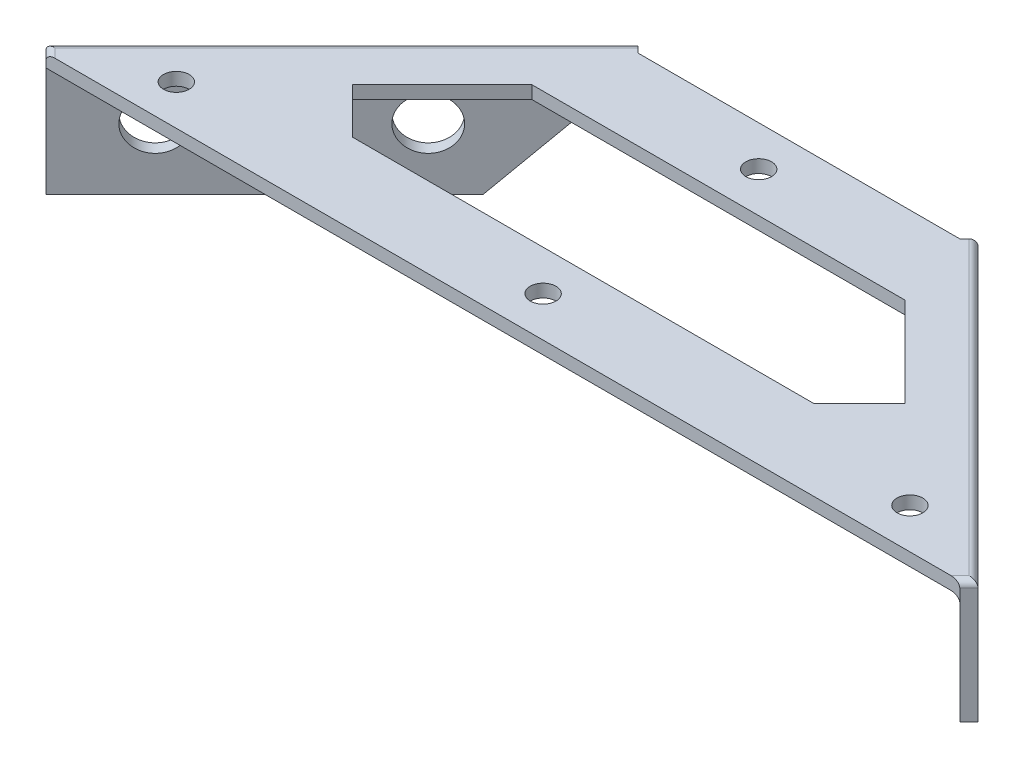
ISO-10303-21;
HEADER;
FILE_DESCRIPTION(('STEP AP214'),'2;1');
FILE_NAME('part.step','',(''),(''),'','','');
FILE_SCHEMA(('AUTOMOTIVE_DESIGN { 1 0 10303 214 1 1 1 1 }'));
ENDSEC;
DATA;
#1=APPLICATION_CONTEXT('core data for automotive mechanical design processes');
#2=APPLICATION_PROTOCOL_DEFINITION('international standard','automotive_design',2000,#1);
#3=PRODUCT_CONTEXT('',#1,'mechanical');
#4=PRODUCT('Part','Part','',(#3));
#5=PRODUCT_RELATED_PRODUCT_CATEGORY('part','',(#4));
#6=PRODUCT_DEFINITION_FORMATION('','',#4);
#7=PRODUCT_DEFINITION_CONTEXT('part definition',#1,'design');
#8=PRODUCT_DEFINITION('design','',#6,#7);
#9=PRODUCT_DEFINITION_SHAPE('','',#8);
#10=(LENGTH_UNIT() NAMED_UNIT(*) SI_UNIT(.MILLI.,.METRE.));
#11=(NAMED_UNIT(*) PLANE_ANGLE_UNIT() SI_UNIT($,.RADIAN.));
#12=(NAMED_UNIT(*) SI_UNIT($,.STERADIAN.) SOLID_ANGLE_UNIT());
#13=UNCERTAINTY_MEASURE_WITH_UNIT(LENGTH_MEASURE(1.E-05),#10,'distance_accuracy_value','');
#14=(GEOMETRIC_REPRESENTATION_CONTEXT(3) GLOBAL_UNCERTAINTY_ASSIGNED_CONTEXT((#13)) GLOBAL_UNIT_ASSIGNED_CONTEXT((#10,
#11,#12)) REPRESENTATION_CONTEXT('',''));
#15=CARTESIAN_POINT('',(0.,0.,0.));
#16=DIRECTION('',(0.,0.,1.));
#17=DIRECTION('',(1.,0.,0.));
#18=AXIS2_PLACEMENT_3D('',#15,#16,#17);
#19=CARTESIAN_POINT('',(24.9999999999995,69.0538238691627,-46.));
#20=DIRECTION('',(-0.707106781186551,0.,-0.707106781186544));
#21=DIRECTION('',(-0.707106781186544,0.,0.707106781186551));
#22=AXIS2_PLACEMENT_3D('',#19,#20,#21);
#23=PLANE('',#22);
#24=DIRECTION('',(0.,-1.,0.));
#25=VECTOR('',#24,1.);
#26=CARTESIAN_POINT('',(26.4142135623726,69.0538238691627,-47.4142135623731));
#27=LINE('',#26,#25);
#28=CARTESIAN_POINT('',(26.4142135623726,1.,-47.4142135623731));
#29=VERTEX_POINT('',#28);
#30=CARTESIAN_POINT('',(26.4142135623726,0.,-47.4142135623731));
#31=VERTEX_POINT('',#30);
#32=EDGE_CURVE('E208',#29,#31,#27,.T.);
#33=ORIENTED_EDGE('',*,*,#32,.T.);
#34=DIRECTION('',(-0.707106781186544,0.,0.707106781186551));
#35=VECTOR('',#34,1.);
#36=CARTESIAN_POINT('',(49.4142135623726,0.,-70.4142135623733));
#37=LINE('',#36,#35);
#38=CARTESIAN_POINT('',(24.9999999999995,0.,-46.));
#39=VERTEX_POINT('',#38);
#40=EDGE_CURVE('E192',#31,#39,#37,.T.);
#41=ORIENTED_EDGE('',*,*,#40,.T.);
#42=DIRECTION('',(0.,-1.,0.));
#43=VECTOR('',#42,1.);
#44=CARTESIAN_POINT('',(24.9999999999995,2.,-46.));
#45=LINE('',#44,#43);
#46=CARTESIAN_POINT('',(24.9999999999995,2.,-46.));
#47=VERTEX_POINT('',#46);
#48=EDGE_CURVE('E261',#47,#39,#45,.T.);
#49=ORIENTED_EDGE('',*,*,#48,.F.);
#50=DIRECTION('',(-0.707106781186544,0.,0.707106781186551));
#51=VECTOR('',#50,1.);
#52=CARTESIAN_POINT('',(24.9999999999995,2.,-46.));
#53=LINE('',#52,#51);
#54=CARTESIAN_POINT('',(25.7071067811861,2.,-46.7071067811865));
#55=VERTEX_POINT('',#54);
#56=EDGE_CURVE('E217',#55,#47,#53,.T.);
#57=ORIENTED_EDGE('',*,*,#56,.F.);
#58=CARTESIAN_POINT('',(25.7071067811861,1.,-46.7071067811866));
#59=DIRECTION('',(-0.707106781186551,0.,-0.707106781186544));
#60=DIRECTION('',(-0.707106781186544,0.,0.707106781186551));
#61=AXIS2_PLACEMENT_3D('',#58,#59,#60);
#62=CIRCLE('',#61,1.);
#63=EDGE_CURVE('E299',#55,#29,#62,.T.);
#64=ORIENTED_EDGE('',*,*,#63,.T.);
#65=EDGE_LOOP('',(#33,#41,#49,#57,#64));
#66=FACE_BOUND('',#65,.T.);
#67=ADVANCED_FACE('F33',(#66),#23,.T.);
#68=CARTESIAN_POINT('',(24.9999999999995,69.0538238691627,-46.));
#69=DIRECTION('',(-0.707106781186544,0.,0.707106781186551));
#70=DIRECTION('',(0.707106781186551,0.,0.707106781186544));
#71=AXIS2_PLACEMENT_3D('',#68,#69,#70);
#72=PLANE('',#71);
#73=CARTESIAN_POINT('',(41.3015151901648,-7.50000000000001,-29.6984848098348));
#74=DIRECTION('',(-0.707106781186544,0.,0.707106781186551));
#75=DIRECTION('',(0.707106781186551,0.,0.707106781186544));
#76=AXIS2_PLACEMENT_3D('',#73,#74,#75);
#77=CIRCLE('',#76,4.);
#78=CARTESIAN_POINT('',(44.129942314911,-7.50000000000001,-26.8700576850887));
#79=VERTEX_POINT('',#78);
#80=EDGE_CURVE('E371',#79,#79,#77,.F.);
#81=ORIENTED_EDGE('',*,*,#80,.T.);
#82=EDGE_LOOP('',(#81));
#83=FACE_BOUND('',#82,.T.);
#84=CARTESIAN_POINT('',(62.5147186257614,-7.5,-8.48528137423854));
#85=DIRECTION('',(-0.707106781186544,0.,0.707106781186551));
#86=DIRECTION('',(0.707106781186551,0.,0.707106781186544));
#87=AXIS2_PLACEMENT_3D('',#84,#85,#86);
#88=CIRCLE('',#87,4.);
#89=CARTESIAN_POINT('',(65.3431457505076,-7.5,-5.65685424949236));
#90=VERTEX_POINT('',#89);
#91=EDGE_CURVE('E368',#90,#90,#88,.F.);
#92=ORIENTED_EDGE('',*,*,#91,.T.);
#93=EDGE_LOOP('',(#92));
#94=FACE_BOUND('',#93,.T.);
#95=DIRECTION('',(-0.707106781186551,0.,-0.707106781186544));
#96=VECTOR('',#95,1.);
#97=CARTESIAN_POINT('',(24.9999999999995,-1.,-46.));
#98=LINE('',#97,#96);
#99=CARTESIAN_POINT('',(71.,-1.,0.));
#100=VERTEX_POINT('',#99);
#101=CARTESIAN_POINT('',(25.7071067811861,-1.,-45.2928932188134));
#102=VERTEX_POINT('',#101);
#103=EDGE_CURVE('E201',#100,#102,#98,.T.);
#104=ORIENTED_EDGE('',*,*,#103,.T.);
#105=DIRECTION('',(0.500000000000005,-0.707106781186544,0.5));
#106=VECTOR('',#105,1.);
#107=CARTESIAN_POINT('',(24.9999999999995,0.,-46.));
#108=LINE('',#107,#106);
#109=CARTESIAN_POINT('',(37.020815280171,-17.,-33.9791847198287));
#110=VERTEX_POINT('',#109);
#111=EDGE_CURVE('E185',#102,#110,#108,.T.);
#112=ORIENTED_EDGE('',*,*,#111,.T.);
#113=DIRECTION('',(-0.707106781186551,0.,-0.707106781186544));
#114=VECTOR('',#113,1.);
#115=CARTESIAN_POINT('',(24.9999999999995,-17.,-46.));
#116=LINE('',#115,#114);
#117=CARTESIAN_POINT('',(71.,-17.,0.));
#118=VERTEX_POINT('',#117);
#119=EDGE_CURVE('E199',#118,#110,#116,.T.);
#120=ORIENTED_EDGE('',*,*,#119,.F.);
#121=DIRECTION('',(0.,-1.,0.));
#122=VECTOR('',#121,1.);
#123=CARTESIAN_POINT('',(71.,69.0538238691627,0.));
#124=LINE('',#123,#122);
#125=EDGE_CURVE('E220',#100,#118,#124,.T.);
#126=ORIENTED_EDGE('',*,*,#125,.F.);
#127=EDGE_LOOP('',(#104,#112,#120,#126));
#128=FACE_BOUND('',#127,.T.);
#129=ADVANCED_FACE('F197',(#83,#94,#128),#72,.T.);
#130=CARTESIAN_POINT('',(26.4142135623726,69.0538238691627,-47.4142135623731));
#131=DIRECTION('',(0.707106781186543,0.,-0.707106781186552));
#132=DIRECTION('',(-0.707106781186552,0.,-0.707106781186543));
#133=AXIS2_PLACEMENT_3D('',#130,#131,#132);
#134=PLANE('',#133);
#135=CARTESIAN_POINT('',(42.7157287525379,-7.50000000000001,-31.112698372208));
#136=DIRECTION('',(-0.707106781186544,0.,0.707106781186551));
#137=DIRECTION('',(0.707106781186551,0.,0.707106781186544));
#138=AXIS2_PLACEMENT_3D('',#135,#136,#137);
#139=CIRCLE('',#138,4.);
#140=CARTESIAN_POINT('',(45.5441558772841,-7.50000000000001,-28.2842712474618));
#141=VERTEX_POINT('',#140);
#142=EDGE_CURVE('E362',#141,#141,#139,.T.);
#143=ORIENTED_EDGE('',*,*,#142,.T.);
#144=EDGE_LOOP('',(#143));
#145=FACE_BOUND('',#144,.T.);
#146=CARTESIAN_POINT('',(63.9289321881345,-7.5,-9.89949493661166));
#147=DIRECTION('',(-0.707106781186544,0.,0.707106781186551));
#148=DIRECTION('',(0.707106781186551,0.,0.707106781186544));
#149=AXIS2_PLACEMENT_3D('',#146,#147,#148);
#150=CIRCLE('',#149,4.);
#151=CARTESIAN_POINT('',(66.7573593128807,-7.5,-7.07106781186549));
#152=VERTEX_POINT('',#151);
#153=EDGE_CURVE('E365',#152,#152,#150,.T.);
#154=ORIENTED_EDGE('',*,*,#153,.T.);
#155=EDGE_LOOP('',(#154));
#156=FACE_BOUND('',#155,.T.);
#157=DIRECTION('',(0.707106781186551,0.,0.707106781186543));
#158=VECTOR('',#157,1.);
#159=CARTESIAN_POINT('',(26.4142135623726,-17.,-47.4142135623731));
#160=LINE('',#159,#158);
#161=CARTESIAN_POINT('',(38.4350288425441,-17.,-35.3933982822017));
#162=VERTEX_POINT('',#161);
#163=CARTESIAN_POINT('',(72.4142135623731,-17.,-1.41421356237312));
#164=VERTEX_POINT('',#163);
#165=EDGE_CURVE('E213',#162,#164,#160,.T.);
#166=ORIENTED_EDGE('',*,*,#165,.F.);
#167=DIRECTION('',(-0.500000000000005,0.707106781186544,-0.5));
#168=VECTOR('',#167,1.);
#169=CARTESIAN_POINT('',(1.99999999999925,34.526911934581,-71.8284271247462));
#170=LINE('',#169,#168);
#171=EDGE_CURVE('E188',#162,#31,#170,.T.);
#172=ORIENTED_EDGE('',*,*,#171,.T.);
#173=ORIENTED_EDGE('',*,*,#32,.F.);
#174=DIRECTION('',(-0.707106781186552,0.,-0.707106781186543));
#175=VECTOR('',#174,1.);
#176=CARTESIAN_POINT('',(72.4142135623731,1.,-1.41421356237313));
#177=LINE('',#176,#175);
#178=CARTESIAN_POINT('',(72.4142135623731,1.,-1.41421356237312));
#179=VERTEX_POINT('',#178);
#180=EDGE_CURVE('E301',#29,#179,#177,.F.);
#181=ORIENTED_EDGE('',*,*,#180,.T.);
#182=DIRECTION('',(0.,-1.,0.));
#183=VECTOR('',#182,1.);
#184=CARTESIAN_POINT('',(72.4142135623731,69.0538238691627,-1.41421356237312));
#185=LINE('',#184,#183);
#186=EDGE_CURVE('E211',#179,#164,#185,.T.);
#187=ORIENTED_EDGE('',*,*,#186,.T.);
#188=EDGE_LOOP('',(#166,#172,#173,#181,#187));
#189=FACE_BOUND('',#188,.T.);
#190=ADVANCED_FACE('F330',(#145,#156,#189),#134,.T.);
#191=CARTESIAN_POINT('',(0.,-17.,0.));
#192=DIRECTION('',(0.,-1.,0.));
#193=DIRECTION('',(0.,0.,-1.));
#194=AXIS2_PLACEMENT_3D('',#191,#192,#193);
#195=PLANE('',#194);
#196=ORIENTED_EDGE('',*,*,#119,.T.);
#197=DIRECTION('',(-0.707106781186544,0.,0.707106781186551));
#198=VECTOR('',#197,1.);
#199=CARTESIAN_POINT('',(61.4350288425441,-17.,-58.393398282202));
#200=LINE('',#199,#198);
#201=EDGE_CURVE('E182',#162,#110,#200,.T.);
#202=ORIENTED_EDGE('',*,*,#201,.F.);
#203=ORIENTED_EDGE('',*,*,#165,.T.);
#204=DIRECTION('',(-0.707106781186557,0.,0.707106781186538));
#205=VECTOR('',#204,1.);
#206=CARTESIAN_POINT('',(71.,-17.,0.));
#207=LINE('',#206,#205);
#208=EDGE_CURVE('E207',#164,#118,#207,.T.);
#209=ORIENTED_EDGE('',*,*,#208,.T.);
#210=EDGE_LOOP('',(#196,#202,#203,#209));
#211=FACE_BOUND('',#210,.T.);
#212=ADVANCED_FACE('F205',(#211),#195,.T.);
#213=CARTESIAN_POINT('',(-71.,2.,0.));
#214=DIRECTION('',(0.,0.,-1.));
#215=DIRECTION('',(-1.,0.,0.));
#216=AXIS2_PLACEMENT_3D('',#213,#214,#215);
#217=PLANE('',#216);
#218=DIRECTION('',(0.,-1.,0.));
#219=VECTOR('',#218,1.);
#220=CARTESIAN_POINT('',(71.,2.,0.));
#221=LINE('',#220,#219);
#222=CARTESIAN_POINT('',(71.,1.,0.));
#223=VERTEX_POINT('',#222);
#224=EDGE_CURVE('E264',#223,#100,#221,.T.);
#225=ORIENTED_EDGE('',*,*,#224,.F.);
#226=CARTESIAN_POINT('',(69.5857864376268,1.,0.));
#227=DIRECTION('',(0.,0.,-1.));
#228=DIRECTION('',(-1.,0.,0.));
#229=AXIS2_PLACEMENT_3D('',#226,#227,#228);
#230=ELLIPSE('',#229,1.41421356237311,1.);
#231=CARTESIAN_POINT('',(69.5857864376268,2.,0.));
#232=VERTEX_POINT('',#231);
#233=EDGE_CURVE('E287',#223,#232,#230,.F.);
#234=ORIENTED_EDGE('',*,*,#233,.T.);
#235=DIRECTION('',(1.,0.,0.));
#236=VECTOR('',#235,1.);
#237=CARTESIAN_POINT('',(-71.,2.,0.));
#238=LINE('',#237,#236);
#239=CARTESIAN_POINT('',(-69.5857864376269,2.,0.));
#240=VERTEX_POINT('',#239);
#241=EDGE_CURVE('E243',#240,#232,#238,.T.);
#242=ORIENTED_EDGE('',*,*,#241,.F.);
#243=CARTESIAN_POINT('',(-69.5857864376269,1.,0.));
#244=DIRECTION('',(0.,0.,-1.));
#245=DIRECTION('',(-1.,0.,0.));
#246=AXIS2_PLACEMENT_3D('',#243,#244,#245);
#247=ELLIPSE('',#246,1.41421356237308,1.);
#248=CARTESIAN_POINT('',(-71.,1.,0.));
#249=VERTEX_POINT('',#248);
#250=EDGE_CURVE('E285',#240,#249,#247,.F.);
#251=ORIENTED_EDGE('',*,*,#250,.T.);
#252=DIRECTION('',(0.,-1.,0.));
#253=VECTOR('',#252,1.);
#254=CARTESIAN_POINT('',(-71.,2.,0.));
#255=LINE('',#254,#253);
#256=CARTESIAN_POINT('',(-71.,0.,0.));
#257=VERTEX_POINT('',#256);
#258=EDGE_CURVE('E249',#249,#257,#255,.T.);
#259=ORIENTED_EDGE('',*,*,#258,.T.);
#260=DIRECTION('',(1.,0.,0.));
#261=VECTOR('',#260,1.);
#262=CARTESIAN_POINT('',(-71.,0.,0.));
#263=LINE('',#262,#261);
#264=CARTESIAN_POINT('',(69.5857864376269,0.,0.));
#265=VERTEX_POINT('',#264);
#266=EDGE_CURVE('E235',#257,#265,#263,.T.);
#267=ORIENTED_EDGE('',*,*,#266,.T.);
#268=CARTESIAN_POINT('',(69.5857864376269,-1.,0.));
#269=DIRECTION('',(0.,0.,-1.));
#270=DIRECTION('',(1.,0.,0.));
#271=AXIS2_PLACEMENT_3D('',#268,#269,#270);
#272=ELLIPSE('',#271,1.4142135623731,1.);
#273=EDGE_CURVE('E41',#265,#100,#272,.T.);
#274=ORIENTED_EDGE('',*,*,#273,.T.);
#275=EDGE_LOOP('',(#225,#234,#242,#251,#259,#267,#274));
#276=FACE_BOUND('',#275,.T.);
#277=ADVANCED_FACE('F339',(#276),#217,.F.);
#278=CARTESIAN_POINT('',(24.9999999999995,2.,-46.));
#279=DIRECTION('',(0.,0.,1.));
#280=DIRECTION('',(1.,0.,0.));
#281=AXIS2_PLACEMENT_3D('',#278,#279,#280);
#282=PLANE('',#281);
#283=ORIENTED_EDGE('',*,*,#48,.T.);
#284=DIRECTION('',(0.,1.,0.));
#285=VECTOR('',#284,1.);
#286=CARTESIAN_POINT('',(24.9999999999995,-17.,-46.));
#287=LINE('',#286,#285);
#288=CARTESIAN_POINT('',(24.9999999999995,-1.,-46.));
#289=VERTEX_POINT('',#288);
#290=EDGE_CURVE('E202',#289,#39,#287,.T.);
#291=ORIENTED_EDGE('',*,*,#290,.F.);
#292=CARTESIAN_POINT('',(23.5857864376264,-1.,-46.));
#293=DIRECTION('',(0.,0.,1.));
#294=DIRECTION('',(1.,0.,0.));
#295=AXIS2_PLACEMENT_3D('',#292,#293,#294);
#296=ELLIPSE('',#295,1.4142135623731,1.);
#297=CARTESIAN_POINT('',(23.5857864376264,0.,-46.));
#298=VERTEX_POINT('',#297);
#299=EDGE_CURVE('E303',#289,#298,#296,.T.);
#300=ORIENTED_EDGE('',*,*,#299,.T.);
#301=DIRECTION('',(-1.,0.,0.));
#302=VECTOR('',#301,1.);
#303=CARTESIAN_POINT('',(24.9999999999995,0.,-46.));
#304=LINE('',#303,#302);
#305=CARTESIAN_POINT('',(-24.9999999999995,0.,-46.));
#306=VERTEX_POINT('',#305);
#307=EDGE_CURVE('E252',#298,#306,#304,.T.);
#308=ORIENTED_EDGE('',*,*,#307,.T.);
#309=DIRECTION('',(0.,-1.,0.));
#310=VECTOR('',#309,1.);
#311=CARTESIAN_POINT('',(-24.9999999999995,2.,-46.));
#312=LINE('',#311,#310);
#313=CARTESIAN_POINT('',(-24.9999999999995,2.,-46.));
#314=VERTEX_POINT('',#313);
#315=EDGE_CURVE('E258',#314,#306,#312,.T.);
#316=ORIENTED_EDGE('',*,*,#315,.F.);
#317=DIRECTION('',(-1.,0.,0.));
#318=VECTOR('',#317,1.);
#319=CARTESIAN_POINT('',(24.9999999999995,2.,-46.));
#320=LINE('',#319,#318);
#321=EDGE_CURVE('E246',#47,#314,#320,.T.);
#322=ORIENTED_EDGE('',*,*,#321,.F.);
#323=EDGE_LOOP('',(#283,#291,#300,#308,#316,#322));
#324=FACE_BOUND('',#323,.T.);
#325=ADVANCED_FACE('F348',(#324),#282,.F.);
#326=CARTESIAN_POINT('',(0.,2.,0.));
#327=DIRECTION('',(0.,-1.,0.));
#328=DIRECTION('',(0.,0.,-1.));
#329=AXIS2_PLACEMENT_3D('',#326,#327,#328);
#330=PLANE('',#329);
#331=CARTESIAN_POINT('',(-57.,2.,-6.24999999999999));
#332=DIRECTION('',(0.,-1.,0.));
#333=DIRECTION('',(0.,0.,1.));
#334=AXIS2_PLACEMENT_3D('',#331,#332,#333);
#335=CIRCLE('',#334,2.00000000000001);
#336=CARTESIAN_POINT('',(-57.,2.,-4.24999999999998));
#337=VERTEX_POINT('',#336);
#338=EDGE_CURVE('E790',#337,#337,#335,.T.);
#339=ORIENTED_EDGE('',*,*,#338,.T.);
#340=EDGE_LOOP('',(#339));
#341=FACE_BOUND('',#340,.T.);
#342=CARTESIAN_POINT('',(57.,2.,-6.25000000000001));
#343=DIRECTION('',(0.,-1.,0.));
#344=DIRECTION('',(0.,0.,-1.));
#345=AXIS2_PLACEMENT_3D('',#342,#343,#344);
#346=CIRCLE('',#345,2.);
#347=CARTESIAN_POINT('',(57.,2.,-8.25000000000001));
#348=VERTEX_POINT('',#347);
#349=EDGE_CURVE('E799',#348,#348,#346,.T.);
#350=ORIENTED_EDGE('',*,*,#349,.T.);
#351=EDGE_LOOP('',(#350));
#352=FACE_BOUND('',#351,.T.);
#353=CARTESIAN_POINT('',(0.,2.,-39.75));
#354=DIRECTION('',(0.,-1.,0.));
#355=DIRECTION('',(0.,0.,-1.));
#356=AXIS2_PLACEMENT_3D('',#353,#354,#355);
#357=CIRCLE('',#356,2.);
#358=CARTESIAN_POINT('',(0.,2.,-41.75));
#359=VERTEX_POINT('',#358);
#360=EDGE_CURVE('E805',#359,#359,#357,.T.);
#361=ORIENTED_EDGE('',*,*,#360,.T.);
#362=EDGE_LOOP('',(#361));
#363=FACE_BOUND('',#362,.T.);
#364=CARTESIAN_POINT('',(0.,2.,-6.25000000000002));
#365=DIRECTION('',(0.,-1.,0.));
#366=DIRECTION('',(0.,0.,-1.));
#367=AXIS2_PLACEMENT_3D('',#364,#365,#366);
#368=CIRCLE('',#367,2.);
#369=CARTESIAN_POINT('',(0.,2.,-8.25000000000002));
#370=VERTEX_POINT('',#369);
#371=EDGE_CURVE('E352',#370,#370,#368,.T.);
#372=ORIENTED_EDGE('',*,*,#371,.T.);
#373=EDGE_LOOP('',(#372));
#374=FACE_BOUND('',#373,.T.);
#375=DIRECTION('',(-1.,0.,0.));
#376=VECTOR('',#375,1.);
#377=CARTESIAN_POINT('',(0.,2.,-12.5));
#378=LINE('',#377,#376);
#379=CARTESIAN_POINT('',(35.8725830020301,2.,-12.5));
#380=VERTEX_POINT('',#379);
#381=CARTESIAN_POINT('',(-35.8725830020301,2.,-12.5));
#382=VERTEX_POINT('',#381);
#383=EDGE_CURVE('E387',#380,#382,#378,.T.);
#384=ORIENTED_EDGE('',*,*,#383,.T.);
#385=DIRECTION('',(-0.707106781186546,0.,-0.707106781186549));
#386=VECTOR('',#385,1.);
#387=CARTESIAN_POINT('',(-11.6862915010151,2.,11.6862915010151));
#388=LINE('',#387,#386);
#389=CARTESIAN_POINT('',(-42.9436508138956,2.,-19.5710678118655));
#390=VERTEX_POINT('',#389);
#391=EDGE_CURVE('E375',#382,#390,#388,.T.);
#392=ORIENTED_EDGE('',*,*,#391,.T.);
#393=DIRECTION('',(0.707106781186548,0.,-0.707106781186547));
#394=VECTOR('',#393,1.);
#395=CARTESIAN_POINT('',(-31.2573593128805,2.,-31.2573593128805));
#396=LINE('',#395,#394);
#397=CARTESIAN_POINT('',(-29.0147186257611,2.,-33.5));
#398=VERTEX_POINT('',#397);
#399=EDGE_CURVE('E378',#390,#398,#396,.T.);
#400=ORIENTED_EDGE('',*,*,#399,.T.);
#401=DIRECTION('',(1.,0.,0.));
#402=VECTOR('',#401,1.);
#403=CARTESIAN_POINT('',(0.,2.,-33.5));
#404=LINE('',#403,#402);
#405=CARTESIAN_POINT('',(29.014718625761,2.,-33.5));
#406=VERTEX_POINT('',#405);
#407=EDGE_CURVE('E56',#398,#406,#404,.T.);
#408=ORIENTED_EDGE('',*,*,#407,.T.);
#409=DIRECTION('',(-0.707106781186548,0.,-0.707106781186547));
#410=VECTOR('',#409,1.);
#411=CARTESIAN_POINT('',(31.2573593128805,2.,-31.2573593128805));
#412=LINE('',#411,#410);
#413=CARTESIAN_POINT('',(42.9436508138956,2.,-19.5710678118655));
#414=VERTEX_POINT('',#413);
#415=EDGE_CURVE('E383',#414,#406,#412,.T.);
#416=ORIENTED_EDGE('',*,*,#415,.F.);
#417=DIRECTION('',(0.707106781186546,0.,-0.707106781186549));
#418=VECTOR('',#417,1.);
#419=CARTESIAN_POINT('',(11.6862915010151,2.,11.6862915010151));
#420=LINE('',#419,#418);
#421=EDGE_CURVE('E385',#380,#414,#420,.T.);
#422=ORIENTED_EDGE('',*,*,#421,.F.);
#423=EDGE_LOOP('',(#384,#392,#400,#408,#416,#422));
#424=FACE_BOUND('',#423,.T.);
#425=DIRECTION('',(-0.707106781186551,0.,0.707106781186544));
#426=VECTOR('',#425,1.);
#427=CARTESIAN_POINT('',(-71.7071067811865,2.,-0.707106781186552));
#428=LINE('',#427,#426);
#429=CARTESIAN_POINT('',(-25.7071067811861,2.,-46.7071067811865));
#430=VERTEX_POINT('',#429);
#431=CARTESIAN_POINT('',(-71.,2.,-1.41421356237309));
#432=VERTEX_POINT('',#431);
#433=EDGE_CURVE('E278',#430,#432,#428,.T.);
#434=ORIENTED_EDGE('',*,*,#433,.T.);
#435=DIRECTION('',(0.707106781186539,0.,0.707106781186556));
#436=VECTOR('',#435,1.);
#437=CARTESIAN_POINT('',(-70.2928932188134,2.,-0.707106781186538));
#438=LINE('',#437,#436);
#439=EDGE_CURVE('E280',#432,#240,#438,.T.);
#440=ORIENTED_EDGE('',*,*,#439,.T.);
#441=ORIENTED_EDGE('',*,*,#241,.T.);
#442=DIRECTION('',(0.707106781186557,0.,-0.707106781186538));
#443=VECTOR('',#442,1.);
#444=CARTESIAN_POINT('',(71.7071067811866,2.,-2.12132034355969));
#445=LINE('',#444,#443);
#446=CARTESIAN_POINT('',(71.,2.,-1.41421356237314));
#447=VERTEX_POINT('',#446);
#448=EDGE_CURVE('E275',#232,#447,#445,.T.);
#449=ORIENTED_EDGE('',*,*,#448,.T.);
#450=DIRECTION('',(-0.707106781186552,0.,-0.707106781186543));
#451=VECTOR('',#450,1.);
#452=CARTESIAN_POINT('',(25.7071067811861,2.,-46.7071067811865));
#453=LINE('',#452,#451);
#454=EDGE_CURVE('E266',#447,#55,#453,.T.);
#455=ORIENTED_EDGE('',*,*,#454,.T.);
#456=ORIENTED_EDGE('',*,*,#56,.T.);
#457=ORIENTED_EDGE('',*,*,#321,.T.);
#458=DIRECTION('',(-0.707106781186543,0.,-0.707106781186552));
#459=VECTOR('',#458,1.);
#460=CARTESIAN_POINT('',(-24.9999999999995,2.,-46.));
#461=LINE('',#460,#459);
#462=EDGE_CURVE('E232',#314,#430,#461,.T.);
#463=ORIENTED_EDGE('',*,*,#462,.T.);
#464=EDGE_LOOP('',(#434,#440,#441,#449,#455,#456,#457,#463));
#465=FACE_BOUND('',#464,.T.);
#466=ADVANCED_FACE('F446',(#341,#352,#363,#374,#424,#465),#330,.F.);
#467=CARTESIAN_POINT('',(0.,0.,0.));
#468=DIRECTION('',(0.,-1.,0.));
#469=DIRECTION('',(0.,0.,-1.));
#470=AXIS2_PLACEMENT_3D('',#467,#468,#469);
#471=PLANE('',#470);
#472=CARTESIAN_POINT('',(-57.,0.,-6.24999999999999));
#473=DIRECTION('',(0.,-1.,0.));
#474=DIRECTION('',(0.,0.,1.));
#475=AXIS2_PLACEMENT_3D('',#472,#473,#474);
#476=CIRCLE('',#475,2.00000000000001);
#477=CARTESIAN_POINT('',(-57.,0.,-4.24999999999998));
#478=VERTEX_POINT('',#477);
#479=EDGE_CURVE('E792',#478,#478,#476,.T.);
#480=ORIENTED_EDGE('',*,*,#479,.F.);
#481=EDGE_LOOP('',(#480));
#482=FACE_BOUND('',#481,.T.);
#483=CARTESIAN_POINT('',(57.,0.,-6.25000000000001));
#484=DIRECTION('',(0.,-1.,0.));
#485=DIRECTION('',(0.,0.,-1.));
#486=AXIS2_PLACEMENT_3D('',#483,#484,#485);
#487=CIRCLE('',#486,2.);
#488=CARTESIAN_POINT('',(57.,0.,-8.25000000000001));
#489=VERTEX_POINT('',#488);
#490=EDGE_CURVE('E794',#489,#489,#487,.T.);
#491=ORIENTED_EDGE('',*,*,#490,.F.);
#492=EDGE_LOOP('',(#491));
#493=FACE_BOUND('',#492,.T.);
#494=CARTESIAN_POINT('',(0.,0.,-39.75));
#495=DIRECTION('',(0.,-1.,0.));
#496=DIRECTION('',(0.,0.,-1.));
#497=AXIS2_PLACEMENT_3D('',#494,#495,#496);
#498=CIRCLE('',#497,2.);
#499=CARTESIAN_POINT('',(0.,0.,-41.75));
#500=VERTEX_POINT('',#499);
#501=EDGE_CURVE('E802',#500,#500,#498,.T.);
#502=ORIENTED_EDGE('',*,*,#501,.F.);
#503=EDGE_LOOP('',(#502));
#504=FACE_BOUND('',#503,.T.);
#505=CARTESIAN_POINT('',(0.,0.,-6.25000000000002));
#506=DIRECTION('',(0.,-1.,0.));
#507=DIRECTION('',(0.,0.,-1.));
#508=AXIS2_PLACEMENT_3D('',#505,#506,#507);
#509=CIRCLE('',#508,2.);
#510=CARTESIAN_POINT('',(0.,0.,-8.25000000000002));
#511=VERTEX_POINT('',#510);
#512=EDGE_CURVE('E355',#511,#511,#509,.T.);
#513=ORIENTED_EDGE('',*,*,#512,.F.);
#514=EDGE_LOOP('',(#513));
#515=FACE_BOUND('',#514,.T.);
#516=DIRECTION('',(-0.707106781186546,0.,-0.707106781186549));
#517=VECTOR('',#516,1.);
#518=CARTESIAN_POINT('',(-11.6862915010151,0.,11.6862915010151));
#519=LINE('',#518,#517);
#520=CARTESIAN_POINT('',(-35.8725830020301,0.,-12.5));
#521=VERTEX_POINT('',#520);
#522=CARTESIAN_POINT('',(-42.9436508138956,0.,-19.5710678118655));
#523=VERTEX_POINT('',#522);
#524=EDGE_CURVE('E374',#521,#523,#519,.T.);
#525=ORIENTED_EDGE('',*,*,#524,.F.);
#526=DIRECTION('',(-1.,0.,0.));
#527=VECTOR('',#526,1.);
#528=CARTESIAN_POINT('',(0.,0.,-12.5));
#529=LINE('',#528,#527);
#530=CARTESIAN_POINT('',(35.8725830020301,0.,-12.5));
#531=VERTEX_POINT('',#530);
#532=EDGE_CURVE('E379',#531,#521,#529,.T.);
#533=ORIENTED_EDGE('',*,*,#532,.F.);
#534=DIRECTION('',(0.707106781186546,0.,-0.707106781186549));
#535=VECTOR('',#534,1.);
#536=CARTESIAN_POINT('',(11.6862915010151,0.,11.6862915010151));
#537=LINE('',#536,#535);
#538=CARTESIAN_POINT('',(42.9436508138956,0.,-19.5710678118655));
#539=VERTEX_POINT('',#538);
#540=EDGE_CURVE('E401',#531,#539,#537,.T.);
#541=ORIENTED_EDGE('',*,*,#540,.T.);
#542=DIRECTION('',(-0.707106781186548,0.,-0.707106781186547));
#543=VECTOR('',#542,1.);
#544=CARTESIAN_POINT('',(31.2573593128805,0.,-31.2573593128805));
#545=LINE('',#544,#543);
#546=CARTESIAN_POINT('',(29.014718625761,0.,-33.5));
#547=VERTEX_POINT('',#546);
#548=EDGE_CURVE('E398',#539,#547,#545,.T.);
#549=ORIENTED_EDGE('',*,*,#548,.T.);
#550=DIRECTION('',(1.,0.,0.));
#551=VECTOR('',#550,1.);
#552=CARTESIAN_POINT('',(0.,0.,-33.5));
#553=LINE('',#552,#551);
#554=CARTESIAN_POINT('',(-29.0147186257611,0.,-33.5));
#555=VERTEX_POINT('',#554);
#556=EDGE_CURVE('E395',#555,#547,#553,.T.);
#557=ORIENTED_EDGE('',*,*,#556,.F.);
#558=DIRECTION('',(0.707106781186548,0.,-0.707106781186547));
#559=VECTOR('',#558,1.);
#560=CARTESIAN_POINT('',(-31.2573593128805,0.,-31.2573593128805));
#561=LINE('',#560,#559);
#562=EDGE_CURVE('E392',#523,#555,#561,.T.);
#563=ORIENTED_EDGE('',*,*,#562,.F.);
#564=EDGE_LOOP('',(#525,#533,#541,#549,#557,#563));
#565=FACE_BOUND('',#564,.T.);
#566=ORIENTED_EDGE('',*,*,#307,.F.);
#567=DIRECTION('',(-0.707106781186551,0.,-0.707106781186544));
#568=VECTOR('',#567,1.);
#569=CARTESIAN_POINT('',(70.2928932188135,0.,0.707106781186559));
#570=LINE('',#569,#568);
#571=EDGE_CURVE('E297',#298,#265,#570,.F.);
#572=ORIENTED_EDGE('',*,*,#571,.T.);
#573=ORIENTED_EDGE('',*,*,#266,.F.);
#574=DIRECTION('',(-0.707106781186551,0.,0.707106781186544));
#575=VECTOR('',#574,1.);
#576=CARTESIAN_POINT('',(-24.9999999999995,0.,-46.));
#577=LINE('',#576,#575);
#578=EDGE_CURVE('E247',#306,#257,#577,.T.);
#579=ORIENTED_EDGE('',*,*,#578,.F.);
#580=EDGE_LOOP('',(#566,#572,#573,#579));
#581=FACE_BOUND('',#580,.T.);
#582=ADVANCED_FACE('F450',(#482,#493,#504,#515,#565,#581),#471,.T.);
#583=CARTESIAN_POINT('',(-24.9999999999995,69.0538238691627,-46.));
#584=DIRECTION('',(0.707106781186552,0.,-0.707106781186543));
#585=DIRECTION('',(-0.707106781186543,0.,-0.707106781186552));
#586=AXIS2_PLACEMENT_3D('',#583,#584,#585);
#587=PLANE('',#586);
#588=DIRECTION('',(0.707106781186544,0.,0.707106781186551));
#589=VECTOR('',#588,1.);
#590=CARTESIAN_POINT('',(-49.4142135623726,0.,-70.4142135623733));
#591=LINE('',#590,#589);
#592=CARTESIAN_POINT('',(-26.4142135623726,0.,-47.4142135623731));
#593=VERTEX_POINT('',#592);
#594=EDGE_CURVE('E316',#593,#306,#591,.T.);
#595=ORIENTED_EDGE('',*,*,#594,.F.);
#596=DIRECTION('',(0.,-1.,0.));
#597=VECTOR('',#596,1.);
#598=CARTESIAN_POINT('',(-26.4142135623726,69.0538238691627,-47.4142135623731));
#599=LINE('',#598,#597);
#600=CARTESIAN_POINT('',(-26.4142135623726,1.,-47.4142135623731));
#601=VERTEX_POINT('',#600);
#602=EDGE_CURVE('E236',#601,#593,#599,.T.);
#603=ORIENTED_EDGE('',*,*,#602,.F.);
#604=CARTESIAN_POINT('',(-25.7071067811861,1.,-46.7071067811865));
#605=DIRECTION('',(0.707106781186552,0.,-0.707106781186543));
#606=DIRECTION('',(-0.707106781186543,0.,-0.707106781186552));
#607=AXIS2_PLACEMENT_3D('',#604,#605,#606);
#608=CIRCLE('',#607,1.);
#609=EDGE_CURVE('E293',#601,#430,#608,.T.);
#610=ORIENTED_EDGE('',*,*,#609,.T.);
#611=ORIENTED_EDGE('',*,*,#462,.F.);
#612=ORIENTED_EDGE('',*,*,#315,.T.);
#613=EDGE_LOOP('',(#595,#603,#610,#611,#612));
#614=FACE_BOUND('',#613,.T.);
#615=ADVANCED_FACE('F440',(#614),#587,.T.);
#616=CARTESIAN_POINT('',(-26.4142135623726,69.0538238691627,-47.4142135623731));
#617=DIRECTION('',(-0.707106781186544,0.,-0.707106781186551));
#618=DIRECTION('',(-0.707106781186551,0.,0.707106781186544));
#619=AXIS2_PLACEMENT_3D('',#616,#617,#618);
#620=PLANE('',#619);
#621=DIRECTION('',(0.500000000000005,0.707106781186544,-0.5));
#622=VECTOR('',#621,1.);
#623=CARTESIAN_POINT('',(-1.99999999999927,34.526911934581,-71.8284271247462));
#624=LINE('',#623,#622);
#625=CARTESIAN_POINT('',(-38.4350288425441,-17.,-35.3933982822017));
#626=VERTEX_POINT('',#625);
#627=EDGE_CURVE('E311',#626,#593,#624,.T.);
#628=ORIENTED_EDGE('',*,*,#627,.F.);
#629=DIRECTION('',(0.707106781186551,0.,-0.707106781186544));
#630=VECTOR('',#629,1.);
#631=CARTESIAN_POINT('',(-26.4142135623726,-17.,-47.4142135623731));
#632=LINE('',#631,#630);
#633=CARTESIAN_POINT('',(-72.4142135623731,-17.,-1.41421356237311));
#634=VERTEX_POINT('',#633);
#635=EDGE_CURVE('E228',#634,#626,#632,.T.);
#636=ORIENTED_EDGE('',*,*,#635,.F.);
#637=DIRECTION('',(0.,-1.,0.));
#638=VECTOR('',#637,1.);
#639=CARTESIAN_POINT('',(-72.4142135623731,69.0538238691627,-1.41421356237311));
#640=LINE('',#639,#638);
#641=CARTESIAN_POINT('',(-72.4142135623731,1.,-1.41421356237311));
#642=VERTEX_POINT('',#641);
#643=EDGE_CURVE('E239',#642,#634,#640,.T.);
#644=ORIENTED_EDGE('',*,*,#643,.F.);
#645=DIRECTION('',(-0.707106781186551,0.,0.707106781186544));
#646=VECTOR('',#645,1.);
#647=CARTESIAN_POINT('',(-26.4142135623726,1.,-47.4142135623731));
#648=LINE('',#647,#646);
#649=EDGE_CURVE('E291',#642,#601,#648,.F.);
#650=ORIENTED_EDGE('',*,*,#649,.T.);
#651=ORIENTED_EDGE('',*,*,#602,.T.);
#652=EDGE_LOOP('',(#628,#636,#644,#650,#651));
#653=FACE_BOUND('',#652,.T.);
#654=CARTESIAN_POINT('',(-42.7157287525379,-7.50000000000001,-31.112698372208));
#655=DIRECTION('',(-0.707106781186544,0.,-0.707106781186551));
#656=DIRECTION('',(-0.707106781186551,0.,0.707106781186544));
#657=AXIS2_PLACEMENT_3D('',#654,#655,#656);
#658=CIRCLE('',#657,4.);
#659=CARTESIAN_POINT('',(-45.5441558772841,-7.50000000000001,-28.2842712474618));
#660=VERTEX_POINT('',#659);
#661=EDGE_CURVE('E308',#660,#660,#658,.T.);
#662=ORIENTED_EDGE('',*,*,#661,.F.);
#663=EDGE_LOOP('',(#662));
#664=FACE_BOUND('',#663,.T.);
#665=CARTESIAN_POINT('',(-63.9289321881345,-7.5,-9.89949493661164));
#666=DIRECTION('',(-0.707106781186544,0.,-0.707106781186551));
#667=DIRECTION('',(-0.707106781186551,0.,0.707106781186544));
#668=AXIS2_PLACEMENT_3D('',#665,#666,#667);
#669=CIRCLE('',#668,4.);
#670=CARTESIAN_POINT('',(-66.7573593128807,-7.5,-7.07106781186546));
#671=VERTEX_POINT('',#670);
#672=EDGE_CURVE('E271',#671,#671,#669,.T.);
#673=ORIENTED_EDGE('',*,*,#672,.F.);
#674=EDGE_LOOP('',(#673));
#675=FACE_BOUND('',#674,.T.);
#676=ADVANCED_FACE('F434',(#653,#664,#675),#620,.T.);
#677=CARTESIAN_POINT('',(-71.,69.0538238691627,0.));
#678=DIRECTION('',(-0.707106781186556,0.,0.707106781186539));
#679=DIRECTION('',(0.707106781186539,0.,0.707106781186556));
#680=AXIS2_PLACEMENT_3D('',#677,#678,#679);
#681=PLANE('',#680);
#682=ORIENTED_EDGE('',*,*,#258,.F.);
#683=DIRECTION('',(0.707106781186539,0.,0.707106781186556));
#684=VECTOR('',#683,1.);
#685=CARTESIAN_POINT('',(-72.4142135623731,1.,-1.41421356237312));
#686=LINE('',#685,#684);
#687=EDGE_CURVE('E289',#249,#642,#686,.F.);
#688=ORIENTED_EDGE('',*,*,#687,.T.);
#689=ORIENTED_EDGE('',*,*,#643,.T.);
#690=DIRECTION('',(-0.707106781186539,0.,-0.707106781186556));
#691=VECTOR('',#690,1.);
#692=CARTESIAN_POINT('',(-71.,-17.,0.));
#693=LINE('',#692,#691);
#694=CARTESIAN_POINT('',(-71.,-17.,0.));
#695=VERTEX_POINT('',#694);
#696=EDGE_CURVE('E225',#695,#634,#693,.T.);
#697=ORIENTED_EDGE('',*,*,#696,.F.);
#698=DIRECTION('',(0.,-1.,0.));
#699=VECTOR('',#698,1.);
#700=CARTESIAN_POINT('',(-71.,69.0538238691627,0.));
#701=LINE('',#700,#699);
#702=EDGE_CURVE('E231',#257,#695,#701,.T.);
#703=ORIENTED_EDGE('',*,*,#702,.F.);
#704=EDGE_LOOP('',(#682,#688,#689,#697,#703));
#705=FACE_BOUND('',#704,.T.);
#706=ADVANCED_FACE('F431',(#705),#681,.T.);
#707=CARTESIAN_POINT('',(-24.9999999999995,69.0538238691627,-46.));
#708=DIRECTION('',(0.707106781186544,0.,0.707106781186551));
#709=DIRECTION('',(0.707106781186551,0.,-0.707106781186544));
#710=AXIS2_PLACEMENT_3D('',#707,#708,#709);
#711=PLANE('',#710);
#712=DIRECTION('',(-0.500000000000005,-0.707106781186544,0.5));
#713=VECTOR('',#712,1.);
#714=CARTESIAN_POINT('',(-24.9999999999995,0.,-46.));
#715=LINE('',#714,#713);
#716=CARTESIAN_POINT('',(-37.020815280171,-17.,-33.9791847198286));
#717=VERTEX_POINT('',#716);
#718=EDGE_CURVE('E321',#306,#717,#715,.T.);
#719=ORIENTED_EDGE('',*,*,#718,.F.);
#720=ORIENTED_EDGE('',*,*,#578,.T.);
#721=ORIENTED_EDGE('',*,*,#702,.T.);
#722=DIRECTION('',(-0.707106781186551,0.,0.707106781186544));
#723=VECTOR('',#722,1.);
#724=CARTESIAN_POINT('',(-24.9999999999995,-17.,-46.));
#725=LINE('',#724,#723);
#726=EDGE_CURVE('E219',#717,#695,#725,.T.);
#727=ORIENTED_EDGE('',*,*,#726,.F.);
#728=EDGE_LOOP('',(#719,#720,#721,#727));
#729=FACE_BOUND('',#728,.T.);
#730=CARTESIAN_POINT('',(-41.3015151901648,-7.50000000000001,-29.6984848098348));
#731=DIRECTION('',(0.707106781186544,0.,0.707106781186551));
#732=DIRECTION('',(0.707106781186551,0.,-0.707106781186544));
#733=AXIS2_PLACEMENT_3D('',#730,#731,#732);
#734=CIRCLE('',#733,4.);
#735=CARTESIAN_POINT('',(-38.4730880654186,-7.50000000000001,-32.526911934581));
#736=VERTEX_POINT('',#735);
#737=EDGE_CURVE('E270',#736,#736,#734,.T.);
#738=ORIENTED_EDGE('',*,*,#737,.F.);
#739=EDGE_LOOP('',(#738));
#740=FACE_BOUND('',#739,.T.);
#741=CARTESIAN_POINT('',(-62.5147186257614,-7.5,-8.48528137423853));
#742=DIRECTION('',(0.707106781186544,0.,0.707106781186551));
#743=DIRECTION('',(0.707106781186551,0.,-0.707106781186544));
#744=AXIS2_PLACEMENT_3D('',#741,#742,#743);
#745=CIRCLE('',#744,4.);
#746=CARTESIAN_POINT('',(-59.6862915010152,-7.5,-11.3137084989847));
#747=VERTEX_POINT('',#746);
#748=EDGE_CURVE('E267',#747,#747,#745,.T.);
#749=ORIENTED_EDGE('',*,*,#748,.F.);
#750=EDGE_LOOP('',(#749));
#751=FACE_BOUND('',#750,.T.);
#752=ADVANCED_FACE('F424',(#729,#740,#751),#711,.T.);
#753=CARTESIAN_POINT('',(0.,-17.,0.));
#754=DIRECTION('',(0.,1.,0.));
#755=DIRECTION('',(0.,0.,1.));
#756=AXIS2_PLACEMENT_3D('',#753,#754,#755);
#757=PLANE('',#756);
#758=ORIENTED_EDGE('',*,*,#635,.T.);
#759=DIRECTION('',(0.707106781186544,0.,0.707106781186551));
#760=VECTOR('',#759,1.);
#761=CARTESIAN_POINT('',(-1.52081528017138,-17.,1.52081528017137));
#762=LINE('',#761,#760);
#763=EDGE_CURVE('E11',#626,#717,#762,.T.);
#764=ORIENTED_EDGE('',*,*,#763,.T.);
#765=ORIENTED_EDGE('',*,*,#726,.T.);
#766=ORIENTED_EDGE('',*,*,#696,.T.);
#767=EDGE_LOOP('',(#758,#764,#765,#766));
#768=FACE_BOUND('',#767,.T.);
#769=ADVANCED_FACE('F422',(#768),#757,.F.);
#770=CARTESIAN_POINT('',(71.,69.0538238691627,0.));
#771=DIRECTION('',(0.707106781186538,0.,0.707106781186557));
#772=DIRECTION('',(0.707106781186557,0.,-0.707106781186538));
#773=AXIS2_PLACEMENT_3D('',#770,#771,#772);
#774=PLANE('',#773);
#775=ORIENTED_EDGE('',*,*,#186,.F.);
#776=DIRECTION('',(0.707106781186557,0.,-0.707106781186538));
#777=VECTOR('',#776,1.);
#778=CARTESIAN_POINT('',(71.,1.,0.));
#779=LINE('',#778,#777);
#780=EDGE_CURVE('E283',#179,#223,#779,.F.);
#781=ORIENTED_EDGE('',*,*,#780,.T.);
#782=ORIENTED_EDGE('',*,*,#224,.T.);
#783=ORIENTED_EDGE('',*,*,#125,.T.);
#784=ORIENTED_EDGE('',*,*,#208,.F.);
#785=EDGE_LOOP('',(#775,#781,#782,#783,#784));
#786=FACE_BOUND('',#785,.T.);
#787=ADVANCED_FACE('F335',(#786),#774,.T.);
#788=CARTESIAN_POINT('',(9.19238815542442,-7.5,63.221825406948));
#789=DIRECTION('',(-0.707106781186544,0.,-0.707106781186551));
#790=DIRECTION('',(-0.707106781186551,0.,0.707106781186544));
#791=AXIS2_PLACEMENT_3D('',#788,#789,#790);
#792=CYLINDRICAL_SURFACE('',#791,4.);
#793=ORIENTED_EDGE('',*,*,#748,.T.);
#794=EDGE_LOOP('',(#793));
#795=FACE_BOUND('',#794,.T.);
#796=ORIENTED_EDGE('',*,*,#672,.T.);
#797=EDGE_LOOP('',(#796));
#798=FACE_BOUND('',#797,.T.);
#799=ADVANCED_FACE('F498',(#795,#798),#792,.F.);
#800=CARTESIAN_POINT('',(30.405591591021,-7.50000000000001,42.0086219713517));
#801=DIRECTION('',(-0.707106781186544,0.,-0.707106781186551));
#802=DIRECTION('',(-0.707106781186551,0.,0.707106781186544));
#803=AXIS2_PLACEMENT_3D('',#800,#801,#802);
#804=CYLINDRICAL_SURFACE('',#803,4.);
#805=ORIENTED_EDGE('',*,*,#737,.T.);
#806=EDGE_LOOP('',(#805));
#807=FACE_BOUND('',#806,.T.);
#808=ORIENTED_EDGE('',*,*,#661,.T.);
#809=EDGE_LOOP('',(#808));
#810=FACE_BOUND('',#809,.T.);
#811=ADVANCED_FACE('F505',(#807,#810),#804,.F.);
#812=CARTESIAN_POINT('',(36.2071067811862,1.,-36.2071067811866));
#813=DIRECTION('',(0.707106781186552,0.,0.707106781186543));
#814=DIRECTION('',(0.707106781186543,0.,-0.707106781186552));
#815=AXIS2_PLACEMENT_3D('',#812,#813,#814);
#816=CYLINDRICAL_SURFACE('',#815,1.);
#817=ORIENTED_EDGE('',*,*,#63,.F.);
#818=ORIENTED_EDGE('',*,*,#454,.F.);
#819=CARTESIAN_POINT('',(71.,1.,-1.41421356237314));
#820=DIRECTION('',(0.,0.,1.));
#821=DIRECTION('',(1.,0.,0.));
#822=AXIS2_PLACEMENT_3D('',#819,#820,#821);
#823=ELLIPSE('',#822,1.41421356237311,1.);
#824=EDGE_CURVE('E307',#179,#447,#823,.T.);
#825=ORIENTED_EDGE('',*,*,#824,.F.);
#826=ORIENTED_EDGE('',*,*,#180,.F.);
#827=EDGE_LOOP('',(#817,#818,#825,#826));
#828=FACE_BOUND('',#827,.T.);
#829=ADVANCED_FACE('F513',(#828),#816,.T.);
#830=CARTESIAN_POINT('',(34.7928932188125,1.,34.7928932188134));
#831=DIRECTION('',(-0.707106781186557,0.,0.707106781186538));
#832=DIRECTION('',(0.707106781186538,0.,0.707106781186557));
#833=AXIS2_PLACEMENT_3D('',#830,#831,#832);
#834=CYLINDRICAL_SURFACE('',#833,1.);
#835=ORIENTED_EDGE('',*,*,#233,.F.);
#836=ORIENTED_EDGE('',*,*,#780,.F.);
#837=ORIENTED_EDGE('',*,*,#824,.T.);
#838=ORIENTED_EDGE('',*,*,#448,.F.);
#839=EDGE_LOOP('',(#835,#836,#837,#838));
#840=FACE_BOUND('',#839,.T.);
#841=ADVANCED_FACE('F521',(#840),#834,.T.);
#842=CARTESIAN_POINT('',(-36.2071067811862,1.,-36.2071067811865));
#843=DIRECTION('',(0.707106781186551,0.,-0.707106781186544));
#844=DIRECTION('',(-0.707106781186544,0.,-0.707106781186551));
#845=AXIS2_PLACEMENT_3D('',#842,#843,#844);
#846=CYLINDRICAL_SURFACE('',#845,1.);
#847=ORIENTED_EDGE('',*,*,#609,.F.);
#848=ORIENTED_EDGE('',*,*,#649,.F.);
#849=CARTESIAN_POINT('',(-71.,1.,-1.4142135623731));
#850=DIRECTION('',(0.,0.,-1.));
#851=DIRECTION('',(1.,0.,0.));
#852=AXIS2_PLACEMENT_3D('',#849,#850,#851);
#853=ELLIPSE('',#852,1.41421356237309,1.);
#854=EDGE_CURVE('E309',#432,#642,#853,.F.);
#855=ORIENTED_EDGE('',*,*,#854,.F.);
#856=ORIENTED_EDGE('',*,*,#433,.F.);
#857=EDGE_LOOP('',(#847,#848,#855,#856));
#858=FACE_BOUND('',#857,.T.);
#859=ADVANCED_FACE('F444',(#858),#846,.T.);
#860=CARTESIAN_POINT('',(-34.7928932188143,1.,34.7928932188135));
#861=DIRECTION('',(-0.707106781186539,0.,-0.707106781186556));
#862=DIRECTION('',(-0.707106781186556,0.,0.707106781186539));
#863=AXIS2_PLACEMENT_3D('',#860,#861,#862);
#864=CYLINDRICAL_SURFACE('',#863,1.);
#865=ORIENTED_EDGE('',*,*,#854,.T.);
#866=ORIENTED_EDGE('',*,*,#687,.F.);
#867=ORIENTED_EDGE('',*,*,#250,.F.);
#868=ORIENTED_EDGE('',*,*,#439,.F.);
#869=EDGE_LOOP('',(#865,#866,#867,#868));
#870=FACE_BOUND('',#869,.T.);
#871=ADVANCED_FACE('F536',(#870),#864,.T.);
#872=CARTESIAN_POINT('',(24.292893218813,-1.,-45.2928932188134));
#873=DIRECTION('',(0.707106781186551,0.,0.707106781186544));
#874=DIRECTION('',(0.707106781186544,0.,-0.707106781186551));
#875=AXIS2_PLACEMENT_3D('',#872,#873,#874);
#876=CYLINDRICAL_SURFACE('',#875,1.);
#877=ORIENTED_EDGE('',*,*,#273,.F.);
#878=ORIENTED_EDGE('',*,*,#571,.F.);
#879=ORIENTED_EDGE('',*,*,#299,.F.);
#880=EDGE_CURVE('E295',#102,#289,#98,.T.);
#881=ORIENTED_EDGE('',*,*,#880,.F.);
#882=ORIENTED_EDGE('',*,*,#103,.F.);
#883=EDGE_LOOP('',(#877,#878,#879,#881,#882));
#884=FACE_BOUND('',#883,.T.);
#885=ADVANCED_FACE('F35',(#884),#876,.F.);
#886=CARTESIAN_POINT('',(-49.4142135623726,0.,-70.4142135623733));
#887=DIRECTION('',(-0.5,0.707106781186551,0.499999999999995));
#888=DIRECTION('',(-0.816496580927727,-0.577350269189624,0.));
#889=AXIS2_PLACEMENT_3D('',#886,#887,#888);
#890=PLANE('',#889);
#891=ORIENTED_EDGE('',*,*,#627,.T.);
#892=ORIENTED_EDGE('',*,*,#594,.T.);
#893=ORIENTED_EDGE('',*,*,#718,.T.);
#894=ORIENTED_EDGE('',*,*,#763,.F.);
#895=EDGE_LOOP('',(#891,#892,#893,#894));
#896=FACE_BOUND('',#895,.T.);
#897=ADVANCED_FACE('F418',(#896),#890,.F.);
#898=CARTESIAN_POINT('',(-11.6862915010151,2.,11.6862915010151));
#899=DIRECTION('',(-0.707106781186549,0.,0.707106781186546));
#900=DIRECTION('',(0.707106781186546,0.,0.707106781186549));
#901=AXIS2_PLACEMENT_3D('',#898,#899,#900);
#902=PLANE('',#901);
#903=ORIENTED_EDGE('',*,*,#524,.T.);
#904=DIRECTION('',(0.,-1.,0.));
#905=VECTOR('',#904,1.);
#906=CARTESIAN_POINT('',(-42.9436508138956,2.,-19.5710678118655));
#907=LINE('',#906,#905);
#908=EDGE_CURVE('E390',#390,#523,#907,.T.);
#909=ORIENTED_EDGE('',*,*,#908,.F.);
#910=ORIENTED_EDGE('',*,*,#391,.F.);
#911=DIRECTION('',(0.,-1.,0.));
#912=VECTOR('',#911,1.);
#913=CARTESIAN_POINT('',(-35.8725830020301,2.,-12.5));
#914=LINE('',#913,#912);
#915=EDGE_CURVE('E406',#382,#521,#914,.T.);
#916=ORIENTED_EDGE('',*,*,#915,.T.);
#917=EDGE_LOOP('',(#903,#909,#910,#916));
#918=FACE_BOUND('',#917,.T.);
#919=ADVANCED_FACE('F555',(#918),#902,.F.);
#920=CARTESIAN_POINT('',(0.,2.,-12.5));
#921=DIRECTION('',(0.,0.,1.));
#922=DIRECTION('',(1.,0.,0.));
#923=AXIS2_PLACEMENT_3D('',#920,#921,#922);
#924=PLANE('',#923);
#925=ORIENTED_EDGE('',*,*,#532,.T.);
#926=ORIENTED_EDGE('',*,*,#915,.F.);
#927=ORIENTED_EDGE('',*,*,#383,.F.);
#928=DIRECTION('',(0.,-1.,0.));
#929=VECTOR('',#928,1.);
#930=CARTESIAN_POINT('',(35.8725830020301,2.,-12.5));
#931=LINE('',#930,#929);
#932=EDGE_CURVE('E408',#380,#531,#931,.T.);
#933=ORIENTED_EDGE('',*,*,#932,.T.);
#934=EDGE_LOOP('',(#925,#926,#927,#933));
#935=FACE_BOUND('',#934,.T.);
#936=ADVANCED_FACE('F562',(#935),#924,.F.);
#937=CARTESIAN_POINT('',(11.6862915010151,2.,11.6862915010151));
#938=DIRECTION('',(-0.707106781186549,0.,-0.707106781186546));
#939=DIRECTION('',(-0.707106781186546,0.,0.707106781186549));
#940=AXIS2_PLACEMENT_3D('',#937,#938,#939);
#941=PLANE('',#940);
#942=ORIENTED_EDGE('',*,*,#540,.F.);
#943=ORIENTED_EDGE('',*,*,#932,.F.);
#944=ORIENTED_EDGE('',*,*,#421,.T.);
#945=DIRECTION('',(0.,-1.,0.));
#946=VECTOR('',#945,1.);
#947=CARTESIAN_POINT('',(42.9436508138956,2.,-19.5710678118655));
#948=LINE('',#947,#946);
#949=EDGE_CURVE('E410',#414,#539,#948,.T.);
#950=ORIENTED_EDGE('',*,*,#949,.T.);
#951=EDGE_LOOP('',(#942,#943,#944,#950));
#952=FACE_BOUND('',#951,.T.);
#953=ADVANCED_FACE('F570',(#952),#941,.T.);
#954=CARTESIAN_POINT('',(31.2573593128805,2.,-31.2573593128805));
#955=DIRECTION('',(-0.707106781186547,0.,0.707106781186548));
#956=DIRECTION('',(0.707106781186548,0.,0.707106781186547));
#957=AXIS2_PLACEMENT_3D('',#954,#955,#956);
#958=PLANE('',#957);
#959=ORIENTED_EDGE('',*,*,#548,.F.);
#960=ORIENTED_EDGE('',*,*,#949,.F.);
#961=ORIENTED_EDGE('',*,*,#415,.T.);
#962=DIRECTION('',(0.,-1.,0.));
#963=VECTOR('',#962,1.);
#964=CARTESIAN_POINT('',(29.014718625761,2.,-33.5));
#965=LINE('',#964,#963);
#966=EDGE_CURVE('E412',#406,#547,#965,.T.);
#967=ORIENTED_EDGE('',*,*,#966,.T.);
#968=EDGE_LOOP('',(#959,#960,#961,#967));
#969=FACE_BOUND('',#968,.T.);
#970=ADVANCED_FACE('F578',(#969),#958,.T.);
#971=CARTESIAN_POINT('',(0.,2.,-33.5));
#972=DIRECTION('',(0.,0.,-1.));
#973=DIRECTION('',(-1.,0.,0.));
#974=AXIS2_PLACEMENT_3D('',#971,#972,#973);
#975=PLANE('',#974);
#976=ORIENTED_EDGE('',*,*,#556,.T.);
#977=ORIENTED_EDGE('',*,*,#966,.F.);
#978=ORIENTED_EDGE('',*,*,#407,.F.);
#979=DIRECTION('',(0.,-1.,0.));
#980=VECTOR('',#979,1.);
#981=CARTESIAN_POINT('',(-29.0147186257611,2.,-33.5));
#982=LINE('',#981,#980);
#983=EDGE_CURVE('E414',#398,#555,#982,.T.);
#984=ORIENTED_EDGE('',*,*,#983,.T.);
#985=EDGE_LOOP('',(#976,#977,#978,#984));
#986=FACE_BOUND('',#985,.T.);
#987=ADVANCED_FACE('F586',(#986),#975,.F.);
#988=CARTESIAN_POINT('',(-31.2573593128805,2.,-31.2573593128805));
#989=DIRECTION('',(-0.707106781186547,0.,-0.707106781186548));
#990=DIRECTION('',(-0.707106781186548,0.,0.707106781186547));
#991=AXIS2_PLACEMENT_3D('',#988,#989,#990);
#992=PLANE('',#991);
#993=ORIENTED_EDGE('',*,*,#562,.T.);
#994=ORIENTED_EDGE('',*,*,#983,.F.);
#995=ORIENTED_EDGE('',*,*,#399,.F.);
#996=ORIENTED_EDGE('',*,*,#908,.T.);
#997=EDGE_LOOP('',(#993,#994,#995,#996));
#998=FACE_BOUND('',#997,.T.);
#999=ADVANCED_FACE('F594',(#998),#992,.F.);
#1000=CARTESIAN_POINT('',(-9.19238815542436,-7.5,63.221825406948));
#1001=DIRECTION('',(0.707106781186544,0.,-0.707106781186551));
#1002=DIRECTION('',(-0.707106781186551,0.,-0.707106781186544));
#1003=AXIS2_PLACEMENT_3D('',#1000,#1001,#1002);
#1004=CYLINDRICAL_SURFACE('',#1003,4.);
#1005=ORIENTED_EDGE('',*,*,#91,.F.);
#1006=EDGE_LOOP('',(#1005));
#1007=FACE_BOUND('',#1006,.T.);
#1008=ORIENTED_EDGE('',*,*,#153,.F.);
#1009=EDGE_LOOP('',(#1008));
#1010=FACE_BOUND('',#1009,.T.);
#1011=ADVANCED_FACE('F601',(#1007,#1010),#1004,.F.);
#1012=CARTESIAN_POINT('',(-30.4055915910209,-7.50000000000001,42.0086219713517));
#1013=DIRECTION('',(0.707106781186544,0.,-0.707106781186551));
#1014=DIRECTION('',(-0.707106781186551,0.,-0.707106781186544));
#1015=AXIS2_PLACEMENT_3D('',#1012,#1013,#1014);
#1016=CYLINDRICAL_SURFACE('',#1015,4.);
#1017=ORIENTED_EDGE('',*,*,#80,.F.);
#1018=EDGE_LOOP('',(#1017));
#1019=FACE_BOUND('',#1018,.T.);
#1020=ORIENTED_EDGE('',*,*,#142,.F.);
#1021=EDGE_LOOP('',(#1020));
#1022=FACE_BOUND('',#1021,.T.);
#1023=ADVANCED_FACE('F608',(#1019,#1022),#1016,.F.);
#1024=CARTESIAN_POINT('',(35.4999999999996,0.,-35.5));
#1025=DIRECTION('',(0.707106781186544,0.,-0.707106781186551));
#1026=DIRECTION('',(0.707106781186551,0.,0.707106781186544));
#1027=AXIS2_PLACEMENT_3D('',#1024,#1025,#1026);
#1028=PLANE('',#1027);
#1029=ORIENTED_EDGE('',*,*,#880,.T.);
#1030=ORIENTED_EDGE('',*,*,#290,.T.);
#1031=EDGE_CURVE('E48',#39,#102,#108,.T.);
#1032=ORIENTED_EDGE('',*,*,#1031,.T.);
#1033=EDGE_LOOP('',(#1029,#1030,#1032));
#1034=FACE_BOUND('',#1033,.T.);
#1035=ADVANCED_FACE('F346',(#1034),#1028,.T.);
#1036=CARTESIAN_POINT('',(49.4142135623726,0.,-70.4142135623733));
#1037=DIRECTION('',(-0.5,-0.707106781186551,-0.499999999999995));
#1038=DIRECTION('',(0.816496580927727,-0.577350269189624,0.));
#1039=AXIS2_PLACEMENT_3D('',#1036,#1037,#1038);
#1040=PLANE('',#1039);
#1041=ORIENTED_EDGE('',*,*,#201,.T.);
#1042=ORIENTED_EDGE('',*,*,#111,.F.);
#1043=ORIENTED_EDGE('',*,*,#1031,.F.);
#1044=ORIENTED_EDGE('',*,*,#40,.F.);
#1045=ORIENTED_EDGE('',*,*,#171,.F.);
#1046=EDGE_LOOP('',(#1041,#1042,#1043,#1044,#1045));
#1047=FACE_BOUND('',#1046,.T.);
#1048=ADVANCED_FACE('F184',(#1047),#1040,.T.);
#1049=CARTESIAN_POINT('',(0.,2.,-6.25000000000002));
#1050=DIRECTION('',(0.,-1.,0.));
#1051=DIRECTION('',(0.,0.,-1.));
#1052=AXIS2_PLACEMENT_3D('',#1049,#1050,#1051);
#1053=CYLINDRICAL_SURFACE('',#1052,2.);
#1054=ORIENTED_EDGE('',*,*,#371,.F.);
#1055=EDGE_LOOP('',(#1054));
#1056=FACE_BOUND('',#1055,.T.);
#1057=ORIENTED_EDGE('',*,*,#512,.T.);
#1058=EDGE_LOOP('',(#1057));
#1059=FACE_BOUND('',#1058,.T.);
#1060=ADVANCED_FACE('F629',(#1056,#1059),#1053,.F.);
#1061=CARTESIAN_POINT('',(0.,2.,-39.75));
#1062=DIRECTION('',(0.,-1.,0.));
#1063=DIRECTION('',(0.,0.,-1.));
#1064=AXIS2_PLACEMENT_3D('',#1061,#1062,#1063);
#1065=CYLINDRICAL_SURFACE('',#1064,2.);
#1066=ORIENTED_EDGE('',*,*,#360,.F.);
#1067=EDGE_LOOP('',(#1066));
#1068=FACE_BOUND('',#1067,.T.);
#1069=ORIENTED_EDGE('',*,*,#501,.T.);
#1070=EDGE_LOOP('',(#1069));
#1071=FACE_BOUND('',#1070,.T.);
#1072=ADVANCED_FACE('F637',(#1068,#1071),#1065,.F.);
#1073=CARTESIAN_POINT('',(57.,2.,-6.25000000000001));
#1074=DIRECTION('',(0.,-1.,0.));
#1075=DIRECTION('',(0.,0.,-1.));
#1076=AXIS2_PLACEMENT_3D('',#1073,#1074,#1075);
#1077=CYLINDRICAL_SURFACE('',#1076,2.);
#1078=ORIENTED_EDGE('',*,*,#349,.F.);
#1079=EDGE_LOOP('',(#1078));
#1080=FACE_BOUND('',#1079,.T.);
#1081=ORIENTED_EDGE('',*,*,#490,.T.);
#1082=EDGE_LOOP('',(#1081));
#1083=FACE_BOUND('',#1082,.T.);
#1084=ADVANCED_FACE('F645',(#1080,#1083),#1077,.F.);
#1085=CARTESIAN_POINT('',(-57.,2.,-6.24999999999999));
#1086=DIRECTION('',(0.,-1.,0.));
#1087=DIRECTION('',(0.,0.,-1.));
#1088=AXIS2_PLACEMENT_3D('',#1085,#1086,#1087);
#1089=CYLINDRICAL_SURFACE('',#1088,2.00000000000001);
#1090=ORIENTED_EDGE('',*,*,#338,.F.);
#1091=EDGE_LOOP('',(#1090));
#1092=FACE_BOUND('',#1091,.T.);
#1093=ORIENTED_EDGE('',*,*,#479,.T.);
#1094=EDGE_LOOP('',(#1093));
#1095=FACE_BOUND('',#1094,.T.);
#1096=ADVANCED_FACE('F653',(#1092,#1095),#1089,.F.);
#1097=CLOSED_SHELL('',(#67,#129,#190,#212,#277,#325,#466,#582,#615,#676,#706,#752,#769,#787,
#799,#811,#829,#841,#859,#871,#885,#897,#919,#936,#953,#970,#987,#999,#1011,#1023,#1035,#1048,
#1060,#1072,#1084,#1096));
#1098=MANIFOLD_SOLID_BREP('B2',#1097);
#1099=ADVANCED_BREP_SHAPE_REPRESENTATION('',(#18,#1098),#14);
#1100=SHAPE_DEFINITION_REPRESENTATION(#9,#1099);
ENDSEC;
END-ISO-10303-21;
